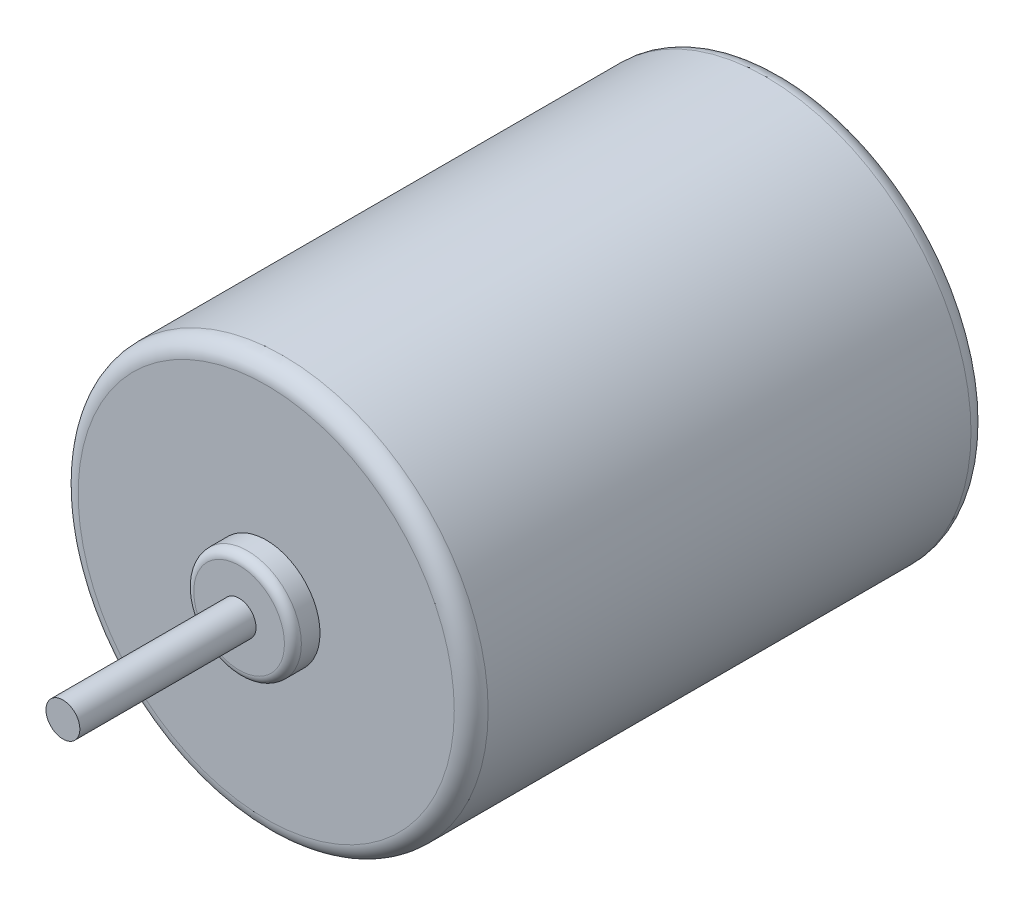
ISO-10303-21;
HEADER;
FILE_DESCRIPTION(('STEP AP214'),'2;1');
FILE_NAME('part.step','',(''),(''),'','','');
FILE_SCHEMA(('AUTOMOTIVE_DESIGN { 1 0 10303 214 1 1 1 1 }'));
ENDSEC;
DATA;
#1=APPLICATION_CONTEXT('core data for automotive mechanical design processes');
#2=APPLICATION_PROTOCOL_DEFINITION('international standard','automotive_design',2000,#1);
#3=PRODUCT_CONTEXT('',#1,'mechanical');
#4=PRODUCT('Part','Part','',(#3));
#5=PRODUCT_RELATED_PRODUCT_CATEGORY('part','',(#4));
#6=PRODUCT_DEFINITION_FORMATION('','',#4);
#7=PRODUCT_DEFINITION_CONTEXT('part definition',#1,'design');
#8=PRODUCT_DEFINITION('design','',#6,#7);
#9=PRODUCT_DEFINITION_SHAPE('','',#8);
#10=(LENGTH_UNIT() NAMED_UNIT(*) SI_UNIT(.MILLI.,.METRE.));
#11=(NAMED_UNIT(*) PLANE_ANGLE_UNIT() SI_UNIT($,.RADIAN.));
#12=(NAMED_UNIT(*) SI_UNIT($,.STERADIAN.) SOLID_ANGLE_UNIT());
#13=UNCERTAINTY_MEASURE_WITH_UNIT(LENGTH_MEASURE(1.E-05),#10,'distance_accuracy_value','');
#14=(GEOMETRIC_REPRESENTATION_CONTEXT(3) GLOBAL_UNCERTAINTY_ASSIGNED_CONTEXT((#13)) GLOBAL_UNIT_ASSIGNED_CONTEXT((#10,
#11,#12)) REPRESENTATION_CONTEXT('',''));
#15=CARTESIAN_POINT('',(0.,0.,0.));
#16=DIRECTION('',(0.,0.,1.));
#17=DIRECTION('',(1.,0.,0.));
#18=AXIS2_PLACEMENT_3D('',#15,#16,#17);
#19=CARTESIAN_POINT('',(0.,0.,30.5));
#20=DIRECTION('',(0.,0.,-1.));
#21=DIRECTION('',(-1.,0.,0.));
#22=AXIS2_PLACEMENT_3D('',#19,#20,#21);
#23=CYLINDRICAL_SURFACE('',#22,12.1);
#24=CARTESIAN_POINT('',(0.,0.,29.5));
#25=DIRECTION('',(0.,0.,1.));
#26=DIRECTION('',(1.,0.,0.));
#27=AXIS2_PLACEMENT_3D('',#24,#25,#26);
#28=CIRCLE('',#27,12.1);
#29=CARTESIAN_POINT('',(-12.1,0.,29.5));
#30=VERTEX_POINT('',#29);
#31=EDGE_CURVE('E54',#30,#30,#28,.F.);
#32=CARTESIAN_POINT('',(0.,0.,1.));
#33=DIRECTION('',(0.,0.,1.));
#34=DIRECTION('',(1.,0.,0.));
#35=AXIS2_PLACEMENT_3D('',#32,#33,#34);
#36=CIRCLE('',#35,12.1);
#37=CARTESIAN_POINT('',(-12.1,0.,0.999999999999997));
#38=VERTEX_POINT('',#37);
#39=EDGE_CURVE('E57',#38,#38,#36,.T.);
#40=CARTESIAN_POINT('',(-12.1,0.,29.5));
#41=CARTESIAN_POINT('',(-12.1,0.,29.203125));
#42=CARTESIAN_POINT('',(-12.1,0.,28.90625));
#43=CARTESIAN_POINT('',(-12.1,0.,28.3125));
#44=CARTESIAN_POINT('',(-12.1,0.,28.015625));
#45=CARTESIAN_POINT('',(-12.1,0.,27.421875));
#46=CARTESIAN_POINT('',(-12.1,0.,27.125));
#47=CARTESIAN_POINT('',(-12.1,0.,26.53125));
#48=CARTESIAN_POINT('',(-12.1,0.,26.234375));
#49=CARTESIAN_POINT('',(-12.1,0.,25.640625));
#50=CARTESIAN_POINT('',(-12.1,0.,25.34375));
#51=CARTESIAN_POINT('',(-12.1,0.,24.75));
#52=CARTESIAN_POINT('',(-12.1,0.,24.453125));
#53=CARTESIAN_POINT('',(-12.1,0.,23.859375));
#54=CARTESIAN_POINT('',(-12.1,0.,23.5625));
#55=CARTESIAN_POINT('',(-12.1,0.,22.96875));
#56=CARTESIAN_POINT('',(-12.1,0.,22.671875));
#57=CARTESIAN_POINT('',(-12.1,0.,22.078125));
#58=CARTESIAN_POINT('',(-12.1,0.,21.78125));
#59=CARTESIAN_POINT('',(-12.1,0.,21.1875));
#60=CARTESIAN_POINT('',(-12.1,0.,20.890625));
#61=CARTESIAN_POINT('',(-12.1,0.,20.296875));
#62=CARTESIAN_POINT('',(-12.1,0.,20.));
#63=CARTESIAN_POINT('',(-12.1,0.,19.40625));
#64=CARTESIAN_POINT('',(-12.1,0.,19.109375));
#65=CARTESIAN_POINT('',(-12.1,0.,18.515625));
#66=CARTESIAN_POINT('',(-12.1,0.,18.21875));
#67=CARTESIAN_POINT('',(-12.1,0.,17.625));
#68=CARTESIAN_POINT('',(-12.1,0.,17.328125));
#69=CARTESIAN_POINT('',(-12.1,0.,16.734375));
#70=CARTESIAN_POINT('',(-12.1,0.,16.4375));
#71=CARTESIAN_POINT('',(-12.1,0.,15.84375));
#72=CARTESIAN_POINT('',(-12.1,0.,15.546875));
#73=CARTESIAN_POINT('',(-12.1,0.,14.953125));
#74=CARTESIAN_POINT('',(-12.1,0.,14.65625));
#75=CARTESIAN_POINT('',(-12.1,0.,14.0625));
#76=CARTESIAN_POINT('',(-12.1,0.,13.765625));
#77=CARTESIAN_POINT('',(-12.1,0.,13.171875));
#78=CARTESIAN_POINT('',(-12.1,0.,12.875));
#79=CARTESIAN_POINT('',(-12.1,0.,12.28125));
#80=CARTESIAN_POINT('',(-12.1,0.,11.984375));
#81=CARTESIAN_POINT('',(-12.1,0.,11.390625));
#82=CARTESIAN_POINT('',(-12.1,0.,11.09375));
#83=CARTESIAN_POINT('',(-12.1,0.,10.5));
#84=CARTESIAN_POINT('',(-12.1,0.,10.203125));
#85=CARTESIAN_POINT('',(-12.1,0.,9.609375));
#86=CARTESIAN_POINT('',(-12.1,0.,9.3125));
#87=CARTESIAN_POINT('',(-12.1,0.,8.71875));
#88=CARTESIAN_POINT('',(-12.1,0.,8.421875));
#89=CARTESIAN_POINT('',(-12.1,0.,7.828125));
#90=CARTESIAN_POINT('',(-12.1,0.,7.53125));
#91=CARTESIAN_POINT('',(-12.1,0.,6.9375));
#92=CARTESIAN_POINT('',(-12.1,0.,6.640625));
#93=CARTESIAN_POINT('',(-12.1,0.,6.046875));
#94=CARTESIAN_POINT('',(-12.1,0.,5.75));
#95=CARTESIAN_POINT('',(-12.1,0.,5.15625));
#96=CARTESIAN_POINT('',(-12.1,0.,4.859375));
#97=CARTESIAN_POINT('',(-12.1,0.,4.265625));
#98=CARTESIAN_POINT('',(-12.1,0.,3.96875));
#99=CARTESIAN_POINT('',(-12.1,0.,3.375));
#100=CARTESIAN_POINT('',(-12.1,0.,3.078125));
#101=CARTESIAN_POINT('',(-12.1,0.,2.484375));
#102=CARTESIAN_POINT('',(-12.1,0.,2.1875));
#103=CARTESIAN_POINT('',(-12.1,0.,1.59375));
#104=CARTESIAN_POINT('',(-12.1,0.,1.296875));
#105=CARTESIAN_POINT('',(-12.1,0.,0.999999999999997));
#106=B_SPLINE_CURVE_WITH_KNOTS('',3,(#40,#41,#42,#43,#44,#45,#46,#47,#48,#49,#50,#51,#52,#53,
#54,#55,#56,#57,#58,#59,#60,#61,#62,#63,#64,#65,#66,#67,#68,#69,#70,#71,#72,#73,#74,#75,#76,#77,
#78,#79,#80,#81,#82,#83,#84,#85,#86,#87,#88,#89,#90,#91,#92,#93,#94,#95,#96,#97,#98,#99,#100,
#101,#102,#103,#104,#105),.UNSPECIFIED.,.F.,.F.,(4,2,2,2,2,2,2,2,2,2,2,2,2,2,2,2,2,2,2,2,2,2,2,
2,2,2,2,2,2,2,2,2,4),(0.,0.890624999999999,1.78125,2.671875,3.5625,4.453125,5.34375,6.234375,
7.125,8.01562499999999,8.90625,9.796875,10.6875,11.578125,12.46875,13.359375,14.25,15.140625,
16.03125,16.921875,17.8125,18.703125,19.59375,20.484375,21.375,22.265625,23.15625,24.046875,
24.9375,25.828125,26.71875,27.609375,28.5),.UNSPECIFIED.);
#107=EDGE_CURVE('BSEAM31',#30,#38,#106,.T.);
#108=ORIENTED_EDGE('',*,*,#31,.T.);
#109=ORIENTED_EDGE('',*,*,#39,.T.);
#110=ORIENTED_EDGE('',*,*,#107,.T.);
#111=ORIENTED_EDGE('',*,*,#107,.F.);
#112=EDGE_LOOP('',(#108,#110,#109,#111));
#113=FACE_BOUND('',#112,.T.);
#114=ADVANCED_FACE('F31',(#113),#23,.T.);
#115=CARTESIAN_POINT('',(0.,0.,30.5));
#116=DIRECTION('',(0.,0.,1.));
#117=DIRECTION('',(1.,0.,0.));
#118=AXIS2_PLACEMENT_3D('',#115,#116,#117);
#119=PLANE('',#118);
#120=CARTESIAN_POINT('',(0.,0.,30.5));
#121=DIRECTION('',(0.,0.,1.));
#122=DIRECTION('',(1.,0.,0.));
#123=AXIS2_PLACEMENT_3D('',#120,#121,#122);
#124=CIRCLE('',#123,11.1);
#125=CARTESIAN_POINT('',(11.1,0.,30.5));
#126=VERTEX_POINT('',#125);
#127=EDGE_CURVE('E60',#126,#126,#124,.T.);
#128=ORIENTED_EDGE('',*,*,#127,.T.);
#129=EDGE_LOOP('',(#128));
#130=FACE_BOUND('',#129,.T.);
#131=CARTESIAN_POINT('',(0.,0.,30.5));
#132=DIRECTION('',(0.,0.,1.));
#133=DIRECTION('',(1.,0.,0.));
#134=AXIS2_PLACEMENT_3D('',#131,#132,#133);
#135=CIRCLE('',#134,3.175);
#136=CARTESIAN_POINT('',(3.175,0.,30.5));
#137=VERTEX_POINT('',#136);
#138=EDGE_CURVE('E66',#137,#137,#135,.T.);
#139=ORIENTED_EDGE('',*,*,#138,.F.);
#140=EDGE_LOOP('',(#139));
#141=FACE_BOUND('',#140,.T.);
#142=ADVANCED_FACE('F96',(#130,#141),#119,.T.);
#143=CARTESIAN_POINT('',(0.,0.,0.));
#144=DIRECTION('',(0.,0.,1.));
#145=DIRECTION('',(1.,0.,0.));
#146=AXIS2_PLACEMENT_3D('',#143,#144,#145);
#147=PLANE('',#146);
#148=CARTESIAN_POINT('',(0.,0.,0.));
#149=DIRECTION('',(0.,0.,1.));
#150=DIRECTION('',(1.,0.,0.));
#151=AXIS2_PLACEMENT_3D('',#148,#149,#150);
#152=CIRCLE('',#151,11.1);
#153=CARTESIAN_POINT('',(11.1,0.,0.));
#154=VERTEX_POINT('',#153);
#155=EDGE_CURVE('E51',#154,#154,#152,.F.);
#156=ORIENTED_EDGE('',*,*,#155,.T.);
#157=EDGE_LOOP('',(#156));
#158=FACE_BOUND('',#157,.T.);
#159=CARTESIAN_POINT('',(0.,0.,0.));
#160=DIRECTION('',(0.,0.,1.));
#161=DIRECTION('',(1.,0.,0.));
#162=AXIS2_PLACEMENT_3D('',#159,#160,#161);
#163=CIRCLE('',#162,4.25);
#164=CARTESIAN_POINT('',(4.25,0.,0.));
#165=VERTEX_POINT('',#164);
#166=EDGE_CURVE('E63',#165,#165,#163,.F.);
#167=ORIENTED_EDGE('',*,*,#166,.F.);
#168=EDGE_LOOP('',(#167));
#169=FACE_BOUND('',#168,.T.);
#170=ADVANCED_FACE('F92',(#158,#169),#147,.F.);
#171=CARTESIAN_POINT('',(0.,0.,32.1));
#172=DIRECTION('',(0.,0.,-1.));
#173=DIRECTION('',(-1.,0.,0.));
#174=AXIS2_PLACEMENT_3D('',#171,#172,#173);
#175=CYLINDRICAL_SURFACE('',#174,3.175);
#176=CARTESIAN_POINT('',(0.,0.,31.6));
#177=DIRECTION('',(0.,0.,1.));
#178=DIRECTION('',(1.,0.,0.));
#179=AXIS2_PLACEMENT_3D('',#176,#177,#178);
#180=CIRCLE('',#179,3.175);
#181=CARTESIAN_POINT('',(3.175,0.,31.6));
#182=VERTEX_POINT('',#181);
#183=EDGE_CURVE('E42',#182,#182,#180,.F.);
#184=ORIENTED_EDGE('',*,*,#183,.T.);
#185=EDGE_LOOP('',(#184));
#186=FACE_BOUND('',#185,.T.);
#187=ORIENTED_EDGE('',*,*,#138,.T.);
#188=EDGE_LOOP('',(#187));
#189=FACE_BOUND('',#188,.T.);
#190=ADVANCED_FACE('F86',(#186,#189),#175,.T.);
#191=CARTESIAN_POINT('',(0.,0.,32.1));
#192=DIRECTION('',(0.,0.,1.));
#193=DIRECTION('',(1.,0.,0.));
#194=AXIS2_PLACEMENT_3D('',#191,#192,#193);
#195=PLANE('',#194);
#196=CARTESIAN_POINT('',(0.,0.,32.1));
#197=DIRECTION('',(0.,0.,1.));
#198=DIRECTION('',(1.,0.,0.));
#199=AXIS2_PLACEMENT_3D('',#196,#197,#198);
#200=CIRCLE('',#199,2.675);
#201=CARTESIAN_POINT('',(2.675,0.,32.1));
#202=VERTEX_POINT('',#201);
#203=EDGE_CURVE('E46',#202,#202,#200,.T.);
#204=ORIENTED_EDGE('',*,*,#203,.T.);
#205=EDGE_LOOP('',(#204));
#206=FACE_BOUND('',#205,.T.);
#207=CARTESIAN_POINT('',(0.,0.,32.1));
#208=DIRECTION('',(0.,0.,1.));
#209=DIRECTION('',(1.,0.,0.));
#210=AXIS2_PLACEMENT_3D('',#207,#208,#209);
#211=CIRCLE('',#210,1.);
#212=CARTESIAN_POINT('',(1.,0.,32.1));
#213=VERTEX_POINT('',#212);
#214=EDGE_CURVE('E70',#213,#213,#211,.T.);
#215=ORIENTED_EDGE('',*,*,#214,.F.);
#216=EDGE_LOOP('',(#215));
#217=FACE_BOUND('',#216,.T.);
#218=ADVANCED_FACE('F81',(#206,#217),#195,.T.);
#219=CARTESIAN_POINT('',(0.,0.,42.5));
#220=DIRECTION('',(0.,0.,-1.));
#221=DIRECTION('',(-1.,0.,0.));
#222=AXIS2_PLACEMENT_3D('',#219,#220,#221);
#223=CYLINDRICAL_SURFACE('',#222,1.);
#224=CARTESIAN_POINT('',(0.,0.,42.5));
#225=DIRECTION('',(0.,0.,1.));
#226=DIRECTION('',(1.,0.,0.));
#227=AXIS2_PLACEMENT_3D('',#224,#225,#226);
#228=CIRCLE('',#227,1.);
#229=CARTESIAN_POINT('',(1.,0.,42.5));
#230=VERTEX_POINT('',#229);
#231=EDGE_CURVE('E69',#230,#230,#228,.T.);
#232=ORIENTED_EDGE('',*,*,#231,.F.);
#233=EDGE_LOOP('',(#232));
#234=FACE_BOUND('',#233,.T.);
#235=ORIENTED_EDGE('',*,*,#214,.T.);
#236=EDGE_LOOP('',(#235));
#237=FACE_BOUND('',#236,.T.);
#238=ADVANCED_FACE('F78',(#234,#237),#223,.T.);
#239=CARTESIAN_POINT('',(0.,0.,42.5));
#240=DIRECTION('',(0.,0.,1.));
#241=DIRECTION('',(1.,0.,0.));
#242=AXIS2_PLACEMENT_3D('',#239,#240,#241);
#243=PLANE('',#242);
#244=ORIENTED_EDGE('',*,*,#231,.T.);
#245=EDGE_LOOP('',(#244));
#246=FACE_BOUND('',#245,.T.);
#247=ADVANCED_FACE('F76',(#246),#243,.T.);
#248=CARTESIAN_POINT('',(0.,0.,-2.));
#249=DIRECTION('',(0.,0.,1.));
#250=DIRECTION('',(1.,0.,0.));
#251=AXIS2_PLACEMENT_3D('',#248,#249,#250);
#252=CYLINDRICAL_SURFACE('',#251,4.25);
#253=CARTESIAN_POINT('',(0.,0.,-1.5));
#254=DIRECTION('',(0.,0.,-1.));
#255=DIRECTION('',(-1.,0.,0.));
#256=AXIS2_PLACEMENT_3D('',#253,#254,#255);
#257=CIRCLE('',#256,4.25);
#258=CARTESIAN_POINT('',(-4.25,0.,-1.5));
#259=VERTEX_POINT('',#258);
#260=EDGE_CURVE('E10',#259,#259,#257,.F.);
#261=ORIENTED_EDGE('',*,*,#260,.T.);
#262=EDGE_LOOP('',(#261));
#263=FACE_BOUND('',#262,.T.);
#264=ORIENTED_EDGE('',*,*,#166,.T.);
#265=EDGE_LOOP('',(#264));
#266=FACE_BOUND('',#265,.T.);
#267=ADVANCED_FACE('F145',(#263,#266),#252,.T.);
#268=CARTESIAN_POINT('',(0.,0.,-2.));
#269=DIRECTION('',(0.,0.,-1.));
#270=DIRECTION('',(-1.,0.,0.));
#271=AXIS2_PLACEMENT_3D('',#268,#269,#270);
#272=PLANE('',#271);
#273=CARTESIAN_POINT('',(0.,0.,-2.));
#274=DIRECTION('',(0.,0.,-1.));
#275=DIRECTION('',(-1.,0.,0.));
#276=AXIS2_PLACEMENT_3D('',#273,#274,#275);
#277=CIRCLE('',#276,3.75);
#278=CARTESIAN_POINT('',(-3.75,0.,-2.));
#279=VERTEX_POINT('',#278);
#280=EDGE_CURVE('E38',#279,#279,#277,.T.);
#281=ORIENTED_EDGE('',*,*,#280,.T.);
#282=EDGE_LOOP('',(#281));
#283=FACE_BOUND('',#282,.T.);
#284=ADVANCED_FACE('F111',(#283),#272,.T.);
#285=CARTESIAN_POINT('',(0.,0.,29.5));
#286=DIRECTION('',(0.,0.,1.));
#287=DIRECTION('',(1.,0.,0.));
#288=AXIS2_PLACEMENT_3D('',#285,#286,#287);
#289=TOROIDAL_SURFACE('',#288,11.1,1.);
#290=ORIENTED_EDGE('',*,*,#31,.F.);
#291=EDGE_LOOP('',(#290));
#292=FACE_BOUND('',#291,.T.);
#293=ORIENTED_EDGE('',*,*,#127,.F.);
#294=EDGE_LOOP('',(#293));
#295=FACE_BOUND('',#294,.T.);
#296=ADVANCED_FACE('F107',(#292,#295),#289,.T.);
#297=CARTESIAN_POINT('',(0.,0.,1.));
#298=DIRECTION('',(0.,0.,1.));
#299=DIRECTION('',(1.,0.,0.));
#300=AXIS2_PLACEMENT_3D('',#297,#298,#299);
#301=TOROIDAL_SURFACE('',#300,11.1,1.);
#302=ORIENTED_EDGE('',*,*,#155,.F.);
#303=EDGE_LOOP('',(#302));
#304=FACE_BOUND('',#303,.T.);
#305=ORIENTED_EDGE('',*,*,#39,.F.);
#306=EDGE_LOOP('',(#305));
#307=FACE_BOUND('',#306,.T.);
#308=ADVANCED_FACE('F110',(#304,#307),#301,.T.);
#309=CARTESIAN_POINT('',(0.,0.,31.6));
#310=DIRECTION('',(0.,0.,1.));
#311=DIRECTION('',(1.,0.,0.));
#312=AXIS2_PLACEMENT_3D('',#309,#310,#311);
#313=TOROIDAL_SURFACE('',#312,2.675,0.5);
#314=ORIENTED_EDGE('',*,*,#183,.F.);
#315=EDGE_LOOP('',(#314));
#316=FACE_BOUND('',#315,.T.);
#317=ORIENTED_EDGE('',*,*,#203,.F.);
#318=EDGE_LOOP('',(#317));
#319=FACE_BOUND('',#318,.T.);
#320=ADVANCED_FACE('F114',(#316,#319),#313,.T.);
#321=CARTESIAN_POINT('',(0.,0.,-1.5));
#322=DIRECTION('',(0.,0.,-1.));
#323=DIRECTION('',(-1.,0.,0.));
#324=AXIS2_PLACEMENT_3D('',#321,#322,#323);
#325=TOROIDAL_SURFACE('',#324,3.75,0.5);
#326=ORIENTED_EDGE('',*,*,#260,.F.);
#327=EDGE_LOOP('',(#326));
#328=FACE_BOUND('',#327,.T.);
#329=ORIENTED_EDGE('',*,*,#280,.F.);
#330=EDGE_LOOP('',(#329));
#331=FACE_BOUND('',#330,.T.);
#332=ADVANCED_FACE('F33',(#328,#331),#325,.T.);
#333=CLOSED_SHELL('',(#114,#142,#170,#190,#218,#238,#247,#267,#284,#296,#308,#320,#332));
#334=MANIFOLD_SOLID_BREP('B2',#333);
#335=ADVANCED_BREP_SHAPE_REPRESENTATION('',(#18,#334),#14);
#336=SHAPE_DEFINITION_REPRESENTATION(#9,#335);
ENDSEC;
END-ISO-10303-21;
